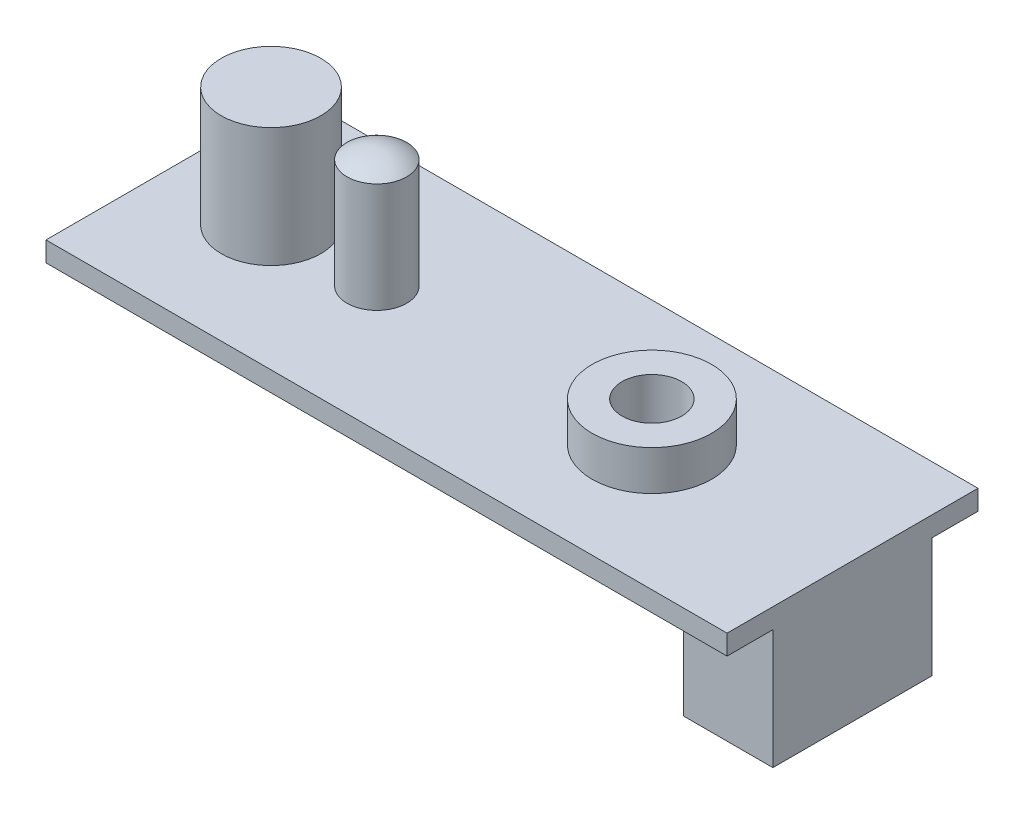
ISO-10303-21;
HEADER;
FILE_DESCRIPTION(('STEP AP214'),'2;1');
FILE_NAME('part.step','',(''),(''),'','','');
FILE_SCHEMA(('AUTOMOTIVE_DESIGN { 1 0 10303 214 1 1 1 1 }'));
ENDSEC;
DATA;
#1=APPLICATION_CONTEXT('core data for automotive mechanical design processes');
#2=APPLICATION_PROTOCOL_DEFINITION('international standard','automotive_design',2000,#1);
#3=PRODUCT_CONTEXT('',#1,'mechanical');
#4=PRODUCT('Part','Part','',(#3));
#5=PRODUCT_RELATED_PRODUCT_CATEGORY('part','',(#4));
#6=PRODUCT_DEFINITION_FORMATION('','',#4);
#7=PRODUCT_DEFINITION_CONTEXT('part definition',#1,'design');
#8=PRODUCT_DEFINITION('design','',#6,#7);
#9=PRODUCT_DEFINITION_SHAPE('','',#8);
#10=(LENGTH_UNIT() NAMED_UNIT(*) SI_UNIT(.MILLI.,.METRE.));
#11=(NAMED_UNIT(*) PLANE_ANGLE_UNIT() SI_UNIT($,.RADIAN.));
#12=(NAMED_UNIT(*) SI_UNIT($,.STERADIAN.) SOLID_ANGLE_UNIT());
#13=UNCERTAINTY_MEASURE_WITH_UNIT(LENGTH_MEASURE(1.E-05),#10,'distance_accuracy_value','');
#14=(GEOMETRIC_REPRESENTATION_CONTEXT(3) GLOBAL_UNCERTAINTY_ASSIGNED_CONTEXT((#13)) GLOBAL_UNIT_ASSIGNED_CONTEXT((#10,
#11,#12)) REPRESENTATION_CONTEXT('',''));
#15=CARTESIAN_POINT('',(0.,0.,0.));
#16=DIRECTION('',(0.,0.,1.));
#17=DIRECTION('',(1.,0.,0.));
#18=AXIS2_PLACEMENT_3D('',#15,#16,#17);
#19=CARTESIAN_POINT('',(0.,0.,0.));
#20=DIRECTION('',(0.,1.,0.));
#21=DIRECTION('',(0.,0.,1.));
#22=AXIS2_PLACEMENT_3D('',#19,#20,#21);
#23=PLANE('',#22);
#24=CARTESIAN_POINT('',(7.02445793982497,0.,0.));
#25=DIRECTION('',(0.,1.,0.));
#26=DIRECTION('',(0.,0.,1.));
#27=AXIS2_PLACEMENT_3D('',#24,#25,#26);
#28=CIRCLE('',#27,1.5);
#29=CARTESIAN_POINT('',(7.02445793982497,0.,1.5));
#30=VERTEX_POINT('',#29);
#31=EDGE_CURVE('E192',#30,#30,#28,.T.);
#32=ORIENTED_EDGE('',*,*,#31,.T.);
#33=EDGE_LOOP('',(#32));
#34=FACE_BOUND('',#33,.T.);
#35=DIRECTION('',(1.,0.,0.));
#36=VECTOR('',#35,1.);
#37=CARTESIAN_POINT('',(12.6,0.,-4.));
#38=LINE('',#37,#36);
#39=CARTESIAN_POINT('',(12.6,0.,-4.));
#40=VERTEX_POINT('',#39);
#41=CARTESIAN_POINT('',(17.1,0.,-4.));
#42=VERTEX_POINT('',#41);
#43=EDGE_CURVE('E39',#40,#42,#38,.T.);
#44=ORIENTED_EDGE('',*,*,#43,.F.);
#45=DIRECTION('',(0.,0.,-1.));
#46=VECTOR('',#45,1.);
#47=CARTESIAN_POINT('',(12.6,0.,4.));
#48=LINE('',#47,#46);
#49=CARTESIAN_POINT('',(12.6,0.,4.));
#50=VERTEX_POINT('',#49);
#51=EDGE_CURVE('E168',#50,#40,#48,.T.);
#52=ORIENTED_EDGE('',*,*,#51,.F.);
#53=DIRECTION('',(-1.,0.,0.));
#54=VECTOR('',#53,1.);
#55=CARTESIAN_POINT('',(17.1,0.,4.));
#56=LINE('',#55,#54);
#57=CARTESIAN_POINT('',(17.1,0.,4.));
#58=VERTEX_POINT('',#57);
#59=EDGE_CURVE('E177',#58,#50,#56,.T.);
#60=ORIENTED_EDGE('',*,*,#59,.F.);
#61=DIRECTION('',(0.,0.,-1.));
#62=VECTOR('',#61,1.);
#63=CARTESIAN_POINT('',(17.1,0.,-6.3));
#64=LINE('',#63,#62);
#65=CARTESIAN_POINT('',(17.1,0.,6.3));
#66=VERTEX_POINT('',#65);
#67=EDGE_CURVE('E227',#66,#58,#64,.T.);
#68=ORIENTED_EDGE('',*,*,#67,.F.);
#69=DIRECTION('',(1.,0.,0.));
#70=VECTOR('',#69,1.);
#71=CARTESIAN_POINT('',(-17.1,0.,6.3));
#72=LINE('',#71,#70);
#73=CARTESIAN_POINT('',(-17.1,0.,6.3));
#74=VERTEX_POINT('',#73);
#75=EDGE_CURVE('E212',#74,#66,#72,.T.);
#76=ORIENTED_EDGE('',*,*,#75,.F.);
#77=DIRECTION('',(0.,0.,1.));
#78=VECTOR('',#77,1.);
#79=CARTESIAN_POINT('',(-17.1,0.,-6.3));
#80=LINE('',#79,#78);
#81=CARTESIAN_POINT('',(-17.1,0.,-6.3));
#82=VERTEX_POINT('',#81);
#83=EDGE_CURVE('E239',#82,#74,#80,.T.);
#84=ORIENTED_EDGE('',*,*,#83,.F.);
#85=DIRECTION('',(-1.,0.,0.));
#86=VECTOR('',#85,1.);
#87=CARTESIAN_POINT('',(-17.1,0.,-6.3));
#88=LINE('',#87,#86);
#89=CARTESIAN_POINT('',(17.1,0.,-6.3));
#90=VERTEX_POINT('',#89);
#91=EDGE_CURVE('E221',#90,#82,#88,.T.);
#92=ORIENTED_EDGE('',*,*,#91,.F.);
#93=EDGE_CURVE('E204',#42,#90,#64,.T.);
#94=ORIENTED_EDGE('',*,*,#93,.F.);
#95=EDGE_LOOP('',(#44,#52,#60,#68,#76,#84,#92,#94));
#96=FACE_BOUND('',#95,.T.);
#97=ADVANCED_FACE('F35',(#34,#96),#23,.F.);
#98=CARTESIAN_POINT('',(0.,1.,0.));
#99=DIRECTION('',(0.,1.,0.));
#100=DIRECTION('',(0.,0.,1.));
#101=AXIS2_PLACEMENT_3D('',#98,#99,#100);
#102=PLANE('',#101);
#103=CARTESIAN_POINT('',(-6.78615612366939,1.,0.));
#104=DIRECTION('',(0.,1.,0.));
#105=DIRECTION('',(0.,0.,1.));
#106=AXIS2_PLACEMENT_3D('',#103,#104,#105);
#107=CIRCLE('',#106,1.5);
#108=CARTESIAN_POINT('',(-6.78615612366939,1.,1.5));
#109=VERTEX_POINT('',#108);
#110=EDGE_CURVE('E197',#109,#109,#107,.T.);
#111=ORIENTED_EDGE('',*,*,#110,.F.);
#112=EDGE_LOOP('',(#111));
#113=FACE_BOUND('',#112,.T.);
#114=DIRECTION('',(0.,0.,-1.));
#115=VECTOR('',#114,1.);
#116=CARTESIAN_POINT('',(17.1,1.,-6.3));
#117=LINE('',#116,#115);
#118=CARTESIAN_POINT('',(17.1,1.,6.3));
#119=VERTEX_POINT('',#118);
#120=CARTESIAN_POINT('',(17.1,1.,-6.3));
#121=VERTEX_POINT('',#120);
#122=EDGE_CURVE('E208',#119,#121,#117,.T.);
#123=ORIENTED_EDGE('',*,*,#122,.T.);
#124=DIRECTION('',(-1.,0.,0.));
#125=VECTOR('',#124,1.);
#126=CARTESIAN_POINT('',(-17.1,1.,-6.3));
#127=LINE('',#126,#125);
#128=CARTESIAN_POINT('',(-17.1,1.,-6.3));
#129=VERTEX_POINT('',#128);
#130=EDGE_CURVE('E211',#121,#129,#127,.T.);
#131=ORIENTED_EDGE('',*,*,#130,.T.);
#132=DIRECTION('',(0.,0.,1.));
#133=VECTOR('',#132,1.);
#134=CARTESIAN_POINT('',(-17.1,1.,-6.3));
#135=LINE('',#134,#133);
#136=CARTESIAN_POINT('',(-17.1,1.,6.3));
#137=VERTEX_POINT('',#136);
#138=EDGE_CURVE('E214',#129,#137,#135,.T.);
#139=ORIENTED_EDGE('',*,*,#138,.T.);
#140=DIRECTION('',(1.,0.,0.));
#141=VECTOR('',#140,1.);
#142=CARTESIAN_POINT('',(-17.1,1.,6.3));
#143=LINE('',#142,#141);
#144=EDGE_CURVE('E216',#137,#119,#143,.T.);
#145=ORIENTED_EDGE('',*,*,#144,.T.);
#146=EDGE_LOOP('',(#123,#131,#139,#145));
#147=FACE_BOUND('',#146,.T.);
#148=CARTESIAN_POINT('',(-12.1,1.,0.));
#149=DIRECTION('',(0.,1.,0.));
#150=DIRECTION('',(0.,0.,1.));
#151=AXIS2_PLACEMENT_3D('',#148,#149,#150);
#152=CIRCLE('',#151,2.5);
#153=CARTESIAN_POINT('',(-12.1,1.,2.5));
#154=VERTEX_POINT('',#153);
#155=EDGE_CURVE('E205',#154,#154,#152,.T.);
#156=ORIENTED_EDGE('',*,*,#155,.F.);
#157=EDGE_LOOP('',(#156));
#158=FACE_BOUND('',#157,.T.);
#159=CARTESIAN_POINT('',(7.02445793982497,1.,0.));
#160=DIRECTION('',(0.,1.,0.));
#161=DIRECTION('',(0.,0.,1.));
#162=AXIS2_PLACEMENT_3D('',#159,#160,#161);
#163=CIRCLE('',#162,3.);
#164=CARTESIAN_POINT('',(7.02445793982497,1.,3.));
#165=VERTEX_POINT('',#164);
#166=EDGE_CURVE('E187',#165,#165,#163,.T.);
#167=ORIENTED_EDGE('',*,*,#166,.F.);
#168=EDGE_LOOP('',(#167));
#169=FACE_BOUND('',#168,.T.);
#170=ADVANCED_FACE('F262',(#113,#147,#158,#169),#102,.T.);
#171=CARTESIAN_POINT('',(17.1,1.,-6.3));
#172=DIRECTION('',(-1.,0.,0.));
#173=DIRECTION('',(0.,0.,1.));
#174=AXIS2_PLACEMENT_3D('',#171,#172,#173);
#175=PLANE('',#174);
#176=ORIENTED_EDGE('',*,*,#67,.T.);
#177=DIRECTION('',(0.,1.,0.));
#178=VECTOR('',#177,1.);
#179=CARTESIAN_POINT('',(17.1,-6.,4.));
#180=LINE('',#179,#178);
#181=CARTESIAN_POINT('',(17.1,-6.,4.));
#182=VERTEX_POINT('',#181);
#183=EDGE_CURVE('E183',#182,#58,#180,.T.);
#184=ORIENTED_EDGE('',*,*,#183,.F.);
#185=DIRECTION('',(0.,0.,1.));
#186=VECTOR('',#185,1.);
#187=CARTESIAN_POINT('',(17.1,-6.,-4.));
#188=LINE('',#187,#186);
#189=CARTESIAN_POINT('',(17.1,-6.,-4.));
#190=VERTEX_POINT('',#189);
#191=EDGE_CURVE('E167',#190,#182,#188,.T.);
#192=ORIENTED_EDGE('',*,*,#191,.F.);
#193=DIRECTION('',(0.,1.,0.));
#194=VECTOR('',#193,1.);
#195=CARTESIAN_POINT('',(17.1,-6.,-4.));
#196=LINE('',#195,#194);
#197=EDGE_CURVE('E188',#190,#42,#196,.T.);
#198=ORIENTED_EDGE('',*,*,#197,.T.);
#199=ORIENTED_EDGE('',*,*,#93,.T.);
#200=DIRECTION('',(0.,-1.,0.));
#201=VECTOR('',#200,1.);
#202=CARTESIAN_POINT('',(17.1,1.,-6.3));
#203=LINE('',#202,#201);
#204=EDGE_CURVE('E11',#121,#90,#203,.T.);
#205=ORIENTED_EDGE('',*,*,#204,.F.);
#206=ORIENTED_EDGE('',*,*,#122,.F.);
#207=DIRECTION('',(0.,-1.,0.));
#208=VECTOR('',#207,1.);
#209=CARTESIAN_POINT('',(17.1,1.,6.3));
#210=LINE('',#209,#208);
#211=EDGE_CURVE('E218',#119,#66,#210,.T.);
#212=ORIENTED_EDGE('',*,*,#211,.T.);
#213=EDGE_LOOP('',(#176,#184,#192,#198,#199,#205,#206,#212));
#214=FACE_BOUND('',#213,.T.);
#215=ADVANCED_FACE('F258',(#214),#175,.F.);
#216=CARTESIAN_POINT('',(-17.1,1.,-6.3));
#217=DIRECTION('',(0.,0.,1.));
#218=DIRECTION('',(1.,0.,0.));
#219=AXIS2_PLACEMENT_3D('',#216,#217,#218);
#220=PLANE('',#219);
#221=ORIENTED_EDGE('',*,*,#91,.T.);
#222=DIRECTION('',(0.,-1.,0.));
#223=VECTOR('',#222,1.);
#224=CARTESIAN_POINT('',(-17.1,1.,-6.3));
#225=LINE('',#224,#223);
#226=EDGE_CURVE('E45',#129,#82,#225,.T.);
#227=ORIENTED_EDGE('',*,*,#226,.F.);
#228=ORIENTED_EDGE('',*,*,#130,.F.);
#229=ORIENTED_EDGE('',*,*,#204,.T.);
#230=EDGE_LOOP('',(#221,#227,#228,#229));
#231=FACE_BOUND('',#230,.T.);
#232=ADVANCED_FACE('F246',(#231),#220,.F.);
#233=CARTESIAN_POINT('',(-17.1,1.,-6.3));
#234=DIRECTION('',(1.,0.,0.));
#235=DIRECTION('',(0.,0.,-1.));
#236=AXIS2_PLACEMENT_3D('',#233,#234,#235);
#237=PLANE('',#236);
#238=ORIENTED_EDGE('',*,*,#83,.T.);
#239=DIRECTION('',(0.,-1.,0.));
#240=VECTOR('',#239,1.);
#241=CARTESIAN_POINT('',(-17.1,1.,6.3));
#242=LINE('',#241,#240);
#243=EDGE_CURVE('E234',#137,#74,#242,.T.);
#244=ORIENTED_EDGE('',*,*,#243,.F.);
#245=ORIENTED_EDGE('',*,*,#138,.F.);
#246=ORIENTED_EDGE('',*,*,#226,.T.);
#247=EDGE_LOOP('',(#238,#244,#245,#246));
#248=FACE_BOUND('',#247,.T.);
#249=ADVANCED_FACE('F249',(#248),#237,.F.);
#250=CARTESIAN_POINT('',(-17.1,1.,6.3));
#251=DIRECTION('',(0.,0.,-1.));
#252=DIRECTION('',(-1.,0.,0.));
#253=AXIS2_PLACEMENT_3D('',#250,#251,#252);
#254=PLANE('',#253);
#255=ORIENTED_EDGE('',*,*,#75,.T.);
#256=ORIENTED_EDGE('',*,*,#211,.F.);
#257=ORIENTED_EDGE('',*,*,#144,.F.);
#258=ORIENTED_EDGE('',*,*,#243,.T.);
#259=EDGE_LOOP('',(#255,#256,#257,#258));
#260=FACE_BOUND('',#259,.T.);
#261=ADVANCED_FACE('F254',(#260),#254,.F.);
#262=CARTESIAN_POINT('',(-12.1,7.,0.));
#263=DIRECTION('',(0.,-1.,0.));
#264=DIRECTION('',(0.,0.,-1.));
#265=AXIS2_PLACEMENT_3D('',#262,#263,#264);
#266=CYLINDRICAL_SURFACE('',#265,2.5);
#267=CARTESIAN_POINT('',(-12.1,7.,0.));
#268=DIRECTION('',(0.,1.,0.));
#269=DIRECTION('',(0.,0.,1.));
#270=AXIS2_PLACEMENT_3D('',#267,#268,#269);
#271=CIRCLE('',#270,2.5);
#272=CARTESIAN_POINT('',(-12.1,7.,2.5));
#273=VERTEX_POINT('',#272);
#274=EDGE_CURVE('E201',#273,#273,#271,.T.);
#275=ORIENTED_EDGE('',*,*,#274,.F.);
#276=EDGE_LOOP('',(#275));
#277=FACE_BOUND('',#276,.T.);
#278=ORIENTED_EDGE('',*,*,#155,.T.);
#279=EDGE_LOOP('',(#278));
#280=FACE_BOUND('',#279,.T.);
#281=ADVANCED_FACE('F298',(#277,#280),#266,.T.);
#282=CARTESIAN_POINT('',(-12.1,7.,0.));
#283=DIRECTION('',(0.,1.,0.));
#284=DIRECTION('',(0.,0.,1.));
#285=AXIS2_PLACEMENT_3D('',#282,#283,#284);
#286=PLANE('',#285);
#287=ORIENTED_EDGE('',*,*,#274,.T.);
#288=EDGE_LOOP('',(#287));
#289=FACE_BOUND('',#288,.T.);
#290=ADVANCED_FACE('F326',(#289),#286,.T.);
#291=CARTESIAN_POINT('',(-6.78615612366939,6.5,0.));
#292=DIRECTION('',(0.,-1.,0.));
#293=DIRECTION('',(0.,0.,-1.));
#294=AXIS2_PLACEMENT_3D('',#291,#292,#293);
#295=CYLINDRICAL_SURFACE('',#294,1.5);
#296=CARTESIAN_POINT('',(-6.78615612366939,6.5,0.));
#297=DIRECTION('',(0.,1.,0.));
#298=DIRECTION('',(0.,0.,1.));
#299=AXIS2_PLACEMENT_3D('',#296,#297,#298);
#300=CIRCLE('',#299,1.5);
#301=CARTESIAN_POINT('',(-6.78615612366939,6.5,1.5));
#302=VERTEX_POINT('',#301);
#303=EDGE_CURVE('E200',#302,#302,#300,.T.);
#304=ORIENTED_EDGE('',*,*,#303,.F.);
#305=EDGE_LOOP('',(#304));
#306=FACE_BOUND('',#305,.T.);
#307=ORIENTED_EDGE('',*,*,#110,.T.);
#308=EDGE_LOOP('',(#307));
#309=FACE_BOUND('',#308,.T.);
#310=ADVANCED_FACE('F333',(#306,#309),#295,.T.);
#311=CARTESIAN_POINT('',(-6.78615612366939,4.5,0.));
#312=DIRECTION('',(0.,0.,1.));
#313=DIRECTION('',(1.,0.,0.));
#314=AXIS2_PLACEMENT_3D('',#311,#312,#313);
#315=SPHERICAL_SURFACE('',#314,2.5);
#316=CARTESIAN_POINT('',(-6.78615612366939,4.5,0.));
#317=DIRECTION('',(0.,1.,0.));
#318=DIRECTION('',(0.,0.,1.));
#319=AXIS2_PLACEMENT_3D('',#316,#317,#318);
#320=SPHERICAL_SURFACE('',#319,2.5);
#321=ORIENTED_EDGE('',*,*,#303,.T.);
#322=EDGE_LOOP('',(#321));
#323=FACE_BOUND('',#322,.T.);
#324=ADVANCED_FACE('F37',(#323),#320,.T.);
#325=CARTESIAN_POINT('',(7.02445793982497,0.,0.));
#326=DIRECTION('',(0.,1.,0.));
#327=DIRECTION('',(0.,0.,1.));
#328=AXIS2_PLACEMENT_3D('',#325,#326,#327);
#329=CYLINDRICAL_SURFACE('',#328,1.5);
#330=ORIENTED_EDGE('',*,*,#31,.F.);
#331=EDGE_LOOP('',(#330));
#332=FACE_BOUND('',#331,.T.);
#333=CARTESIAN_POINT('',(7.02445793982497,3.,0.));
#334=DIRECTION('',(0.,1.,0.));
#335=DIRECTION('',(0.,0.,1.));
#336=AXIS2_PLACEMENT_3D('',#333,#334,#335);
#337=CIRCLE('',#336,1.5);
#338=CARTESIAN_POINT('',(7.02445793982497,3.,1.5));
#339=VERTEX_POINT('',#338);
#340=EDGE_CURVE('E184',#339,#339,#337,.T.);
#341=ORIENTED_EDGE('',*,*,#340,.T.);
#342=EDGE_LOOP('',(#341));
#343=FACE_BOUND('',#342,.T.);
#344=ADVANCED_FACE('F284',(#332,#343),#329,.F.);
#345=CARTESIAN_POINT('',(7.02445793982497,3.,0.));
#346=DIRECTION('',(0.,1.,0.));
#347=DIRECTION('',(0.,0.,1.));
#348=AXIS2_PLACEMENT_3D('',#345,#346,#347);
#349=PLANE('',#348);
#350=CARTESIAN_POINT('',(7.02445793982497,3.,0.));
#351=DIRECTION('',(0.,1.,0.));
#352=DIRECTION('',(0.,0.,1.));
#353=AXIS2_PLACEMENT_3D('',#350,#351,#352);
#354=CIRCLE('',#353,3.);
#355=CARTESIAN_POINT('',(7.02445793982497,3.,3.));
#356=VERTEX_POINT('',#355);
#357=EDGE_CURVE('E189',#356,#356,#354,.T.);
#358=ORIENTED_EDGE('',*,*,#357,.T.);
#359=EDGE_LOOP('',(#358));
#360=FACE_BOUND('',#359,.T.);
#361=ORIENTED_EDGE('',*,*,#340,.F.);
#362=EDGE_LOOP('',(#361));
#363=FACE_BOUND('',#362,.T.);
#364=ADVANCED_FACE('F274',(#360,#363),#349,.T.);
#365=CARTESIAN_POINT('',(7.02445793982497,3.,0.));
#366=DIRECTION('',(0.,-1.,0.));
#367=DIRECTION('',(0.,0.,-1.));
#368=AXIS2_PLACEMENT_3D('',#365,#366,#367);
#369=CYLINDRICAL_SURFACE('',#368,3.);
#370=ORIENTED_EDGE('',*,*,#357,.F.);
#371=EDGE_LOOP('',(#370));
#372=FACE_BOUND('',#371,.T.);
#373=ORIENTED_EDGE('',*,*,#166,.T.);
#374=EDGE_LOOP('',(#373));
#375=FACE_BOUND('',#374,.T.);
#376=ADVANCED_FACE('F271',(#372,#375),#369,.T.);
#377=CARTESIAN_POINT('',(12.6,-6.,-4.));
#378=DIRECTION('',(0.,0.,1.));
#379=DIRECTION('',(1.,0.,0.));
#380=AXIS2_PLACEMENT_3D('',#377,#378,#379);
#381=PLANE('',#380);
#382=ORIENTED_EDGE('',*,*,#43,.T.);
#383=ORIENTED_EDGE('',*,*,#197,.F.);
#384=DIRECTION('',(1.,0.,0.));
#385=VECTOR('',#384,1.);
#386=CARTESIAN_POINT('',(12.6,-6.,-4.));
#387=LINE('',#386,#385);
#388=CARTESIAN_POINT('',(12.6,-6.,-4.));
#389=VERTEX_POINT('',#388);
#390=EDGE_CURVE('E164',#389,#190,#387,.T.);
#391=ORIENTED_EDGE('',*,*,#390,.F.);
#392=DIRECTION('',(0.,1.,0.));
#393=VECTOR('',#392,1.);
#394=CARTESIAN_POINT('',(12.6,-6.,-4.));
#395=LINE('',#394,#393);
#396=EDGE_CURVE('E173',#389,#40,#395,.T.);
#397=ORIENTED_EDGE('',*,*,#396,.T.);
#398=EDGE_LOOP('',(#382,#383,#391,#397));
#399=FACE_BOUND('',#398,.T.);
#400=ADVANCED_FACE('F273',(#399),#381,.F.);
#401=CARTESIAN_POINT('',(17.1,-6.,4.));
#402=DIRECTION('',(0.,0.,-1.));
#403=DIRECTION('',(-1.,0.,0.));
#404=AXIS2_PLACEMENT_3D('',#401,#402,#403);
#405=PLANE('',#404);
#406=ORIENTED_EDGE('',*,*,#59,.T.);
#407=DIRECTION('',(0.,1.,0.));
#408=VECTOR('',#407,1.);
#409=CARTESIAN_POINT('',(12.6,-6.,4.));
#410=LINE('',#409,#408);
#411=CARTESIAN_POINT('',(12.6,-6.,4.));
#412=VERTEX_POINT('',#411);
#413=EDGE_CURVE('E180',#412,#50,#410,.T.);
#414=ORIENTED_EDGE('',*,*,#413,.F.);
#415=DIRECTION('',(-1.,0.,0.));
#416=VECTOR('',#415,1.);
#417=CARTESIAN_POINT('',(17.1,-6.,4.));
#418=LINE('',#417,#416);
#419=EDGE_CURVE('E170',#182,#412,#418,.T.);
#420=ORIENTED_EDGE('',*,*,#419,.F.);
#421=ORIENTED_EDGE('',*,*,#183,.T.);
#422=EDGE_LOOP('',(#406,#414,#420,#421));
#423=FACE_BOUND('',#422,.T.);
#424=ADVANCED_FACE('F281',(#423),#405,.F.);
#425=CARTESIAN_POINT('',(12.6,-6.,4.));
#426=DIRECTION('',(1.,0.,0.));
#427=DIRECTION('',(0.,0.,-1.));
#428=AXIS2_PLACEMENT_3D('',#425,#426,#427);
#429=PLANE('',#428);
#430=ORIENTED_EDGE('',*,*,#51,.T.);
#431=ORIENTED_EDGE('',*,*,#396,.F.);
#432=DIRECTION('',(0.,0.,-1.));
#433=VECTOR('',#432,1.);
#434=CARTESIAN_POINT('',(12.6,-6.,4.));
#435=LINE('',#434,#433);
#436=EDGE_CURVE('E172',#412,#389,#435,.T.);
#437=ORIENTED_EDGE('',*,*,#436,.F.);
#438=ORIENTED_EDGE('',*,*,#413,.T.);
#439=EDGE_LOOP('',(#430,#431,#437,#438));
#440=FACE_BOUND('',#439,.T.);
#441=ADVANCED_FACE('F385',(#440),#429,.F.);
#442=CARTESIAN_POINT('',(0.,-6.,0.));
#443=DIRECTION('',(0.,-1.,0.));
#444=DIRECTION('',(0.,0.,-1.));
#445=AXIS2_PLACEMENT_3D('',#442,#443,#444);
#446=PLANE('',#445);
#447=DIRECTION('',(0.,0.,1.));
#448=VECTOR('',#447,1.);
#449=CARTESIAN_POINT('',(16.5416183298104,-6.,3.249241546927));
#450=LINE('',#449,#448);
#451=CARTESIAN_POINT('',(16.5416183298104,-6.,-3.249241546927));
#452=VERTEX_POINT('',#451);
#453=CARTESIAN_POINT('',(16.5416183298104,-6.,3.249241546927));
#454=VERTEX_POINT('',#453);
#455=EDGE_CURVE('E53',#452,#454,#450,.T.);
#456=ORIENTED_EDGE('',*,*,#455,.F.);
#457=DIRECTION('',(1.,0.,0.));
#458=VECTOR('',#457,1.);
#459=CARTESIAN_POINT('',(13.1583816701896,-6.,-3.249241546927));
#460=LINE('',#459,#458);
#461=CARTESIAN_POINT('',(13.1583816701896,-6.,-3.249241546927));
#462=VERTEX_POINT('',#461);
#463=EDGE_CURVE('E146',#462,#452,#460,.T.);
#464=ORIENTED_EDGE('',*,*,#463,.F.);
#465=DIRECTION('',(0.,0.,-1.));
#466=VECTOR('',#465,1.);
#467=CARTESIAN_POINT('',(13.1583816701896,-6.,3.249241546927));
#468=LINE('',#467,#466);
#469=CARTESIAN_POINT('',(13.1583816701896,-6.,3.249241546927));
#470=VERTEX_POINT('',#469);
#471=EDGE_CURVE('E149',#470,#462,#468,.T.);
#472=ORIENTED_EDGE('',*,*,#471,.F.);
#473=DIRECTION('',(-1.,0.,0.));
#474=VECTOR('',#473,1.);
#475=CARTESIAN_POINT('',(13.1583816701896,-6.,3.249241546927));
#476=LINE('',#475,#474);
#477=EDGE_CURVE('E155',#454,#470,#476,.T.);
#478=ORIENTED_EDGE('',*,*,#477,.F.);
#479=EDGE_LOOP('',(#456,#464,#472,#478));
#480=FACE_BOUND('',#479,.T.);
#481=ORIENTED_EDGE('',*,*,#390,.T.);
#482=ORIENTED_EDGE('',*,*,#191,.T.);
#483=ORIENTED_EDGE('',*,*,#419,.T.);
#484=ORIENTED_EDGE('',*,*,#436,.T.);
#485=EDGE_LOOP('',(#481,#482,#483,#484));
#486=FACE_BOUND('',#485,.T.);
#487=ADVANCED_FACE('F394',(#480,#486),#446,.T.);
#488=CARTESIAN_POINT('',(16.5416183298104,-1.,3.249241546927));
#489=DIRECTION('',(1.,0.,0.));
#490=DIRECTION('',(0.,0.,-1.));
#491=AXIS2_PLACEMENT_3D('',#488,#489,#490);
#492=PLANE('',#491);
#493=ORIENTED_EDGE('',*,*,#455,.T.);
#494=DIRECTION('',(0.,-1.,0.));
#495=VECTOR('',#494,1.);
#496=CARTESIAN_POINT('',(16.5416183298104,-1.,3.249241546927));
#497=LINE('',#496,#495);
#498=CARTESIAN_POINT('',(16.5416183298104,-1.,3.249241546927));
#499=VERTEX_POINT('',#498);
#500=EDGE_CURVE('E124',#499,#454,#497,.T.);
#501=ORIENTED_EDGE('',*,*,#500,.F.);
#502=DIRECTION('',(0.,0.,1.));
#503=VECTOR('',#502,1.);
#504=CARTESIAN_POINT('',(16.5416183298104,-1.,3.249241546927));
#505=LINE('',#504,#503);
#506=CARTESIAN_POINT('',(16.5416183298104,-1.,-3.249241546927));
#507=VERTEX_POINT('',#506);
#508=EDGE_CURVE('E128',#507,#499,#505,.T.);
#509=ORIENTED_EDGE('',*,*,#508,.F.);
#510=DIRECTION('',(0.,-1.,0.));
#511=VECTOR('',#510,1.);
#512=CARTESIAN_POINT('',(16.5416183298104,-1.,-3.249241546927));
#513=LINE('',#512,#511);
#514=EDGE_CURVE('E159',#507,#452,#513,.T.);
#515=ORIENTED_EDGE('',*,*,#514,.T.);
#516=EDGE_LOOP('',(#493,#501,#509,#515));
#517=FACE_BOUND('',#516,.T.);
#518=ADVANCED_FACE('F126',(#517),#492,.F.);
#519=CARTESIAN_POINT('',(13.1583816701896,-1.,-3.249241546927));
#520=DIRECTION('',(0.,0.,-1.));
#521=DIRECTION('',(-1.,0.,0.));
#522=AXIS2_PLACEMENT_3D('',#519,#520,#521);
#523=PLANE('',#522);
#524=ORIENTED_EDGE('',*,*,#463,.T.);
#525=ORIENTED_EDGE('',*,*,#514,.F.);
#526=DIRECTION('',(1.,0.,0.));
#527=VECTOR('',#526,1.);
#528=CARTESIAN_POINT('',(13.1583816701896,-1.,-3.249241546927));
#529=LINE('',#528,#527);
#530=CARTESIAN_POINT('',(13.1583816701896,-1.,-3.249241546927));
#531=VERTEX_POINT('',#530);
#532=EDGE_CURVE('E134',#531,#507,#529,.T.);
#533=ORIENTED_EDGE('',*,*,#532,.F.);
#534=DIRECTION('',(0.,-1.,0.));
#535=VECTOR('',#534,1.);
#536=CARTESIAN_POINT('',(13.1583816701896,-1.,-3.249241546927));
#537=LINE('',#536,#535);
#538=EDGE_CURVE('E161',#531,#462,#537,.T.);
#539=ORIENTED_EDGE('',*,*,#538,.T.);
#540=EDGE_LOOP('',(#524,#525,#533,#539));
#541=FACE_BOUND('',#540,.T.);
#542=ADVANCED_FACE('F411',(#541),#523,.F.);
#543=CARTESIAN_POINT('',(13.1583816701896,-1.,3.249241546927));
#544=DIRECTION('',(-1.,0.,0.));
#545=DIRECTION('',(0.,0.,1.));
#546=AXIS2_PLACEMENT_3D('',#543,#544,#545);
#547=PLANE('',#546);
#548=ORIENTED_EDGE('',*,*,#471,.T.);
#549=ORIENTED_EDGE('',*,*,#538,.F.);
#550=DIRECTION('',(0.,0.,-1.));
#551=VECTOR('',#550,1.);
#552=CARTESIAN_POINT('',(13.1583816701896,-1.,3.249241546927));
#553=LINE('',#552,#551);
#554=CARTESIAN_POINT('',(13.1583816701896,-1.,3.249241546927));
#555=VERTEX_POINT('',#554);
#556=EDGE_CURVE('E142',#555,#531,#553,.T.);
#557=ORIENTED_EDGE('',*,*,#556,.F.);
#558=DIRECTION('',(0.,-1.,0.));
#559=VECTOR('',#558,1.);
#560=CARTESIAN_POINT('',(13.1583816701896,-1.,3.249241546927));
#561=LINE('',#560,#559);
#562=EDGE_CURVE('E133',#555,#470,#561,.T.);
#563=ORIENTED_EDGE('',*,*,#562,.T.);
#564=EDGE_LOOP('',(#548,#549,#557,#563));
#565=FACE_BOUND('',#564,.T.);
#566=ADVANCED_FACE('F419',(#565),#547,.F.);
#567=CARTESIAN_POINT('',(13.1583816701896,-1.,3.249241546927));
#568=DIRECTION('',(0.,0.,1.));
#569=DIRECTION('',(1.,0.,0.));
#570=AXIS2_PLACEMENT_3D('',#567,#568,#569);
#571=PLANE('',#570);
#572=ORIENTED_EDGE('',*,*,#477,.T.);
#573=ORIENTED_EDGE('',*,*,#562,.F.);
#574=DIRECTION('',(-1.,0.,0.));
#575=VECTOR('',#574,1.);
#576=CARTESIAN_POINT('',(13.1583816701896,-1.,3.249241546927));
#577=LINE('',#576,#575);
#578=EDGE_CURVE('E137',#499,#555,#577,.T.);
#579=ORIENTED_EDGE('',*,*,#578,.F.);
#580=ORIENTED_EDGE('',*,*,#500,.T.);
#581=EDGE_LOOP('',(#572,#573,#579,#580));
#582=FACE_BOUND('',#581,.T.);
#583=ADVANCED_FACE('F138',(#582),#571,.F.);
#584=CARTESIAN_POINT('',(0.,-1.,0.));
#585=DIRECTION('',(0.,-1.,0.));
#586=DIRECTION('',(0.,0.,-1.));
#587=AXIS2_PLACEMENT_3D('',#584,#585,#586);
#588=PLANE('',#587);
#589=ORIENTED_EDGE('',*,*,#508,.T.);
#590=ORIENTED_EDGE('',*,*,#578,.T.);
#591=ORIENTED_EDGE('',*,*,#556,.T.);
#592=ORIENTED_EDGE('',*,*,#532,.T.);
#593=EDGE_LOOP('',(#589,#590,#591,#592));
#594=FACE_BOUND('',#593,.T.);
#595=ADVANCED_FACE('F144',(#594),#588,.T.);
#596=CLOSED_SHELL('',(#97,#170,#215,#232,#249,#261,#281,#290,#310,#324,#344,#364,#376,#400,#424,
#441,#487,#518,#542,#566,#583,#595));
#597=MANIFOLD_SOLID_BREP('B2',#596);
#598=ADVANCED_BREP_SHAPE_REPRESENTATION('',(#18,#597),#14);
#599=SHAPE_DEFINITION_REPRESENTATION(#9,#598);
ENDSEC;
END-ISO-10303-21;
